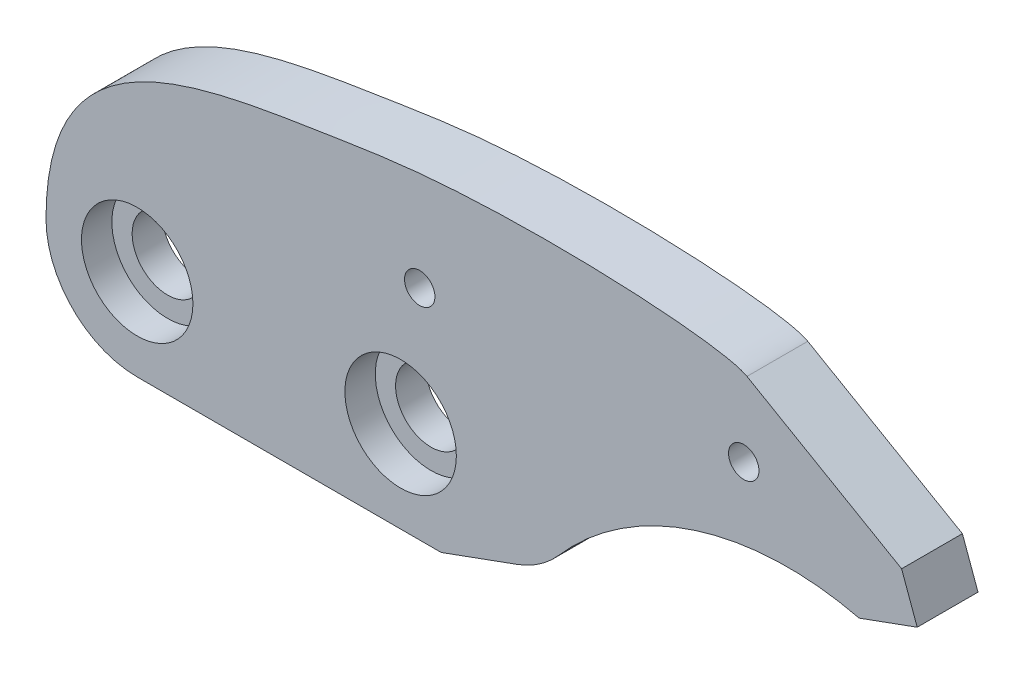
ISO-10303-21;
HEADER;
FILE_DESCRIPTION(('STEP AP214'),'2;1');
FILE_NAME('part.step','',(''),(''),'','','');
FILE_SCHEMA(('AUTOMOTIVE_DESIGN { 1 0 10303 214 1 1 1 1 }'));
ENDSEC;
DATA;
#1=APPLICATION_CONTEXT('core data for automotive mechanical design processes');
#2=APPLICATION_PROTOCOL_DEFINITION('international standard','automotive_design',2000,#1);
#3=PRODUCT_CONTEXT('',#1,'mechanical');
#4=PRODUCT('Part','Part','',(#3));
#5=PRODUCT_RELATED_PRODUCT_CATEGORY('part','',(#4));
#6=PRODUCT_DEFINITION_FORMATION('','',#4);
#7=PRODUCT_DEFINITION_CONTEXT('part definition',#1,'design');
#8=PRODUCT_DEFINITION('design','',#6,#7);
#9=PRODUCT_DEFINITION_SHAPE('','',#8);
#10=(LENGTH_UNIT() NAMED_UNIT(*) SI_UNIT(.MILLI.,.METRE.));
#11=(NAMED_UNIT(*) PLANE_ANGLE_UNIT() SI_UNIT($,.RADIAN.));
#12=(NAMED_UNIT(*) SI_UNIT($,.STERADIAN.) SOLID_ANGLE_UNIT());
#13=UNCERTAINTY_MEASURE_WITH_UNIT(LENGTH_MEASURE(1.E-05),#10,'distance_accuracy_value','');
#14=(GEOMETRIC_REPRESENTATION_CONTEXT(3) GLOBAL_UNCERTAINTY_ASSIGNED_CONTEXT((#13)) GLOBAL_UNIT_ASSIGNED_CONTEXT((#10,
#11,#12)) REPRESENTATION_CONTEXT('',''));
#15=CARTESIAN_POINT('',(0.,0.,0.));
#16=DIRECTION('',(0.,0.,1.));
#17=DIRECTION('',(1.,0.,0.));
#18=AXIS2_PLACEMENT_3D('',#15,#16,#17);
#19=CARTESIAN_POINT('',(0.,0.,6.));
#20=DIRECTION('',(0.,0.,-1.));
#21=DIRECTION('',(-1.,0.,0.));
#22=AXIS2_PLACEMENT_3D('',#19,#20,#21);
#23=CYLINDRICAL_SURFACE('',#22,3.5);
#24=CARTESIAN_POINT('',(0.,0.,0.));
#25=DIRECTION('',(0.,0.,1.));
#26=DIRECTION('',(1.,0.,0.));
#27=AXIS2_PLACEMENT_3D('',#24,#25,#26);
#28=CIRCLE('',#27,3.5);
#29=CARTESIAN_POINT('',(-3.5,0.,0.));
#30=VERTEX_POINT('',#29);
#31=EDGE_CURVE('E266',#30,#30,#28,.T.);
#32=CARTESIAN_POINT('',(0.,0.,3.));
#33=DIRECTION('',(0.,0.,1.));
#34=DIRECTION('',(1.,0.,0.));
#35=AXIS2_PLACEMENT_3D('',#32,#33,#34);
#36=CIRCLE('',#35,3.5);
#37=CARTESIAN_POINT('',(-3.5,0.,3.));
#38=VERTEX_POINT('',#37);
#39=EDGE_CURVE('E42',#38,#38,#36,.T.);
#40=CARTESIAN_POINT('',(-3.5,0.,0.));
#41=CARTESIAN_POINT('',(-3.5,0.,0.03125));
#42=CARTESIAN_POINT('',(-3.5,0.,0.0625000000000001));
#43=CARTESIAN_POINT('',(-3.5,0.,0.125));
#44=CARTESIAN_POINT('',(-3.5,0.,0.15625));
#45=CARTESIAN_POINT('',(-3.5,0.,0.21875));
#46=CARTESIAN_POINT('',(-3.5,0.,0.25));
#47=CARTESIAN_POINT('',(-3.5,0.,0.3125));
#48=CARTESIAN_POINT('',(-3.5,0.,0.34375));
#49=CARTESIAN_POINT('',(-3.5,0.,0.40625));
#50=CARTESIAN_POINT('',(-3.5,0.,0.4375));
#51=CARTESIAN_POINT('',(-3.5,0.,0.5));
#52=CARTESIAN_POINT('',(-3.5,0.,0.53125));
#53=CARTESIAN_POINT('',(-3.5,0.,0.593750000000001));
#54=CARTESIAN_POINT('',(-3.5,0.,0.625000000000001));
#55=CARTESIAN_POINT('',(-3.5,0.,0.687500000000001));
#56=CARTESIAN_POINT('',(-3.5,0.,0.718750000000001));
#57=CARTESIAN_POINT('',(-3.5,0.,0.781250000000001));
#58=CARTESIAN_POINT('',(-3.5,0.,0.812500000000001));
#59=CARTESIAN_POINT('',(-3.5,0.,0.875));
#60=CARTESIAN_POINT('',(-3.5,0.,0.90625));
#61=CARTESIAN_POINT('',(-3.5,0.,0.96875));
#62=CARTESIAN_POINT('',(-3.5,0.,1.));
#63=CARTESIAN_POINT('',(-3.5,0.,1.0625));
#64=CARTESIAN_POINT('',(-3.5,0.,1.09375));
#65=CARTESIAN_POINT('',(-3.5,0.,1.15625));
#66=CARTESIAN_POINT('',(-3.5,0.,1.1875));
#67=CARTESIAN_POINT('',(-3.5,0.,1.25));
#68=CARTESIAN_POINT('',(-3.5,0.,1.28125));
#69=CARTESIAN_POINT('',(-3.5,0.,1.34375));
#70=CARTESIAN_POINT('',(-3.5,0.,1.375));
#71=CARTESIAN_POINT('',(-3.5,0.,1.4375));
#72=CARTESIAN_POINT('',(-3.5,0.,1.46875));
#73=CARTESIAN_POINT('',(-3.5,0.,1.53125));
#74=CARTESIAN_POINT('',(-3.5,0.,1.5625));
#75=CARTESIAN_POINT('',(-3.5,0.,1.625));
#76=CARTESIAN_POINT('',(-3.5,0.,1.65625));
#77=CARTESIAN_POINT('',(-3.5,0.,1.71875));
#78=CARTESIAN_POINT('',(-3.5,0.,1.75));
#79=CARTESIAN_POINT('',(-3.5,0.,1.8125));
#80=CARTESIAN_POINT('',(-3.5,0.,1.84375));
#81=CARTESIAN_POINT('',(-3.5,0.,1.90625));
#82=CARTESIAN_POINT('',(-3.5,0.,1.9375));
#83=CARTESIAN_POINT('',(-3.5,0.,2.));
#84=CARTESIAN_POINT('',(-3.5,0.,2.03125));
#85=CARTESIAN_POINT('',(-3.5,0.,2.09375));
#86=CARTESIAN_POINT('',(-3.5,0.,2.125));
#87=CARTESIAN_POINT('',(-3.5,0.,2.1875));
#88=CARTESIAN_POINT('',(-3.5,0.,2.21875));
#89=CARTESIAN_POINT('',(-3.5,0.,2.28125));
#90=CARTESIAN_POINT('',(-3.5,0.,2.3125));
#91=CARTESIAN_POINT('',(-3.5,0.,2.375));
#92=CARTESIAN_POINT('',(-3.5,0.,2.40625));
#93=CARTESIAN_POINT('',(-3.5,0.,2.46875));
#94=CARTESIAN_POINT('',(-3.5,0.,2.5));
#95=CARTESIAN_POINT('',(-3.5,0.,2.5625));
#96=CARTESIAN_POINT('',(-3.5,0.,2.59375));
#97=CARTESIAN_POINT('',(-3.5,0.,2.65625));
#98=CARTESIAN_POINT('',(-3.5,0.,2.6875));
#99=CARTESIAN_POINT('',(-3.5,0.,2.75));
#100=CARTESIAN_POINT('',(-3.5,0.,2.78125));
#101=CARTESIAN_POINT('',(-3.5,0.,2.84375));
#102=CARTESIAN_POINT('',(-3.5,0.,2.875));
#103=CARTESIAN_POINT('',(-3.5,0.,2.9375));
#104=CARTESIAN_POINT('',(-3.5,0.,2.96875));
#105=CARTESIAN_POINT('',(-3.5,0.,3.));
#106=B_SPLINE_CURVE_WITH_KNOTS('',3,(#40,#41,#42,#43,#44,#45,#46,#47,#48,#49,#50,#51,#52,#53,
#54,#55,#56,#57,#58,#59,#60,#61,#62,#63,#64,#65,#66,#67,#68,#69,#70,#71,#72,#73,#74,#75,#76,#77,
#78,#79,#80,#81,#82,#83,#84,#85,#86,#87,#88,#89,#90,#91,#92,#93,#94,#95,#96,#97,#98,#99,#100,
#101,#102,#103,#104,#105),.UNSPECIFIED.,.F.,.F.,(4,2,2,2,2,2,2,2,2,2,2,2,2,2,2,2,2,2,2,2,2,2,2,
2,2,2,2,2,2,2,2,2,4),(0.,0.0937500000000001,0.1875,0.28125,0.375,0.46875,0.5625,
0.656250000000001,0.750000000000001,0.843750000000001,0.9375,1.03125,1.125,1.21875,1.3125,
1.40625,1.5,1.59375,1.6875,1.78125,1.875,1.96875,2.0625,2.15625,2.25,2.34375,2.4375,2.53125,
2.625,2.71875,2.8125,2.90625,3.),.UNSPECIFIED.);
#107=EDGE_CURVE('BSEAM38',#30,#38,#106,.T.);
#108=ORIENTED_EDGE('',*,*,#31,.F.);
#109=ORIENTED_EDGE('',*,*,#39,.T.);
#110=ORIENTED_EDGE('',*,*,#107,.T.);
#111=ORIENTED_EDGE('',*,*,#107,.F.);
#112=EDGE_LOOP('',(#108,#110,#109,#111));
#113=FACE_BOUND('',#112,.T.);
#114=ADVANCED_FACE('F38',(#113),#23,.F.);
#115=CARTESIAN_POINT('',(26.,0.,6.));
#116=DIRECTION('',(0.,0.,-1.));
#117=DIRECTION('',(-1.,0.,0.));
#118=AXIS2_PLACEMENT_3D('',#115,#116,#117);
#119=CYLINDRICAL_SURFACE('',#118,3.5);
#120=CARTESIAN_POINT('',(26.,0.,0.));
#121=DIRECTION('',(0.,0.,1.));
#122=DIRECTION('',(1.,0.,0.));
#123=AXIS2_PLACEMENT_3D('',#120,#121,#122);
#124=CIRCLE('',#123,3.5);
#125=CARTESIAN_POINT('',(22.5,0.,0.));
#126=VERTEX_POINT('',#125);
#127=EDGE_CURVE('E127',#126,#126,#124,.T.);
#128=CARTESIAN_POINT('',(26.,0.,3.));
#129=DIRECTION('',(0.,0.,1.));
#130=DIRECTION('',(1.,0.,0.));
#131=AXIS2_PLACEMENT_3D('',#128,#129,#130);
#132=CIRCLE('',#131,3.5);
#133=CARTESIAN_POINT('',(22.5,0.,3.));
#134=VERTEX_POINT('',#133);
#135=EDGE_CURVE('E165',#134,#134,#132,.T.);
#136=CARTESIAN_POINT('',(22.5,0.,0.));
#137=CARTESIAN_POINT('',(22.5,0.,0.03125));
#138=CARTESIAN_POINT('',(22.5,0.,0.0625000000000001));
#139=CARTESIAN_POINT('',(22.5,0.,0.125));
#140=CARTESIAN_POINT('',(22.5,0.,0.15625));
#141=CARTESIAN_POINT('',(22.5,0.,0.21875));
#142=CARTESIAN_POINT('',(22.5,0.,0.25));
#143=CARTESIAN_POINT('',(22.5,0.,0.3125));
#144=CARTESIAN_POINT('',(22.5,0.,0.34375));
#145=CARTESIAN_POINT('',(22.5,0.,0.40625));
#146=CARTESIAN_POINT('',(22.5,0.,0.4375));
#147=CARTESIAN_POINT('',(22.5,0.,0.5));
#148=CARTESIAN_POINT('',(22.5,0.,0.53125));
#149=CARTESIAN_POINT('',(22.5,0.,0.593750000000001));
#150=CARTESIAN_POINT('',(22.5,0.,0.625000000000001));
#151=CARTESIAN_POINT('',(22.5,0.,0.687500000000001));
#152=CARTESIAN_POINT('',(22.5,0.,0.718750000000001));
#153=CARTESIAN_POINT('',(22.5,0.,0.781250000000001));
#154=CARTESIAN_POINT('',(22.5,0.,0.812500000000001));
#155=CARTESIAN_POINT('',(22.5,0.,0.875));
#156=CARTESIAN_POINT('',(22.5,0.,0.90625));
#157=CARTESIAN_POINT('',(22.5,0.,0.96875));
#158=CARTESIAN_POINT('',(22.5,0.,1.));
#159=CARTESIAN_POINT('',(22.5,0.,1.0625));
#160=CARTESIAN_POINT('',(22.5,0.,1.09375));
#161=CARTESIAN_POINT('',(22.5,0.,1.15625));
#162=CARTESIAN_POINT('',(22.5,0.,1.1875));
#163=CARTESIAN_POINT('',(22.5,0.,1.25));
#164=CARTESIAN_POINT('',(22.5,0.,1.28125));
#165=CARTESIAN_POINT('',(22.5,0.,1.34375));
#166=CARTESIAN_POINT('',(22.5,0.,1.375));
#167=CARTESIAN_POINT('',(22.5,0.,1.4375));
#168=CARTESIAN_POINT('',(22.5,0.,1.46875));
#169=CARTESIAN_POINT('',(22.5,0.,1.53125));
#170=CARTESIAN_POINT('',(22.5,0.,1.5625));
#171=CARTESIAN_POINT('',(22.5,0.,1.625));
#172=CARTESIAN_POINT('',(22.5,0.,1.65625));
#173=CARTESIAN_POINT('',(22.5,0.,1.71875));
#174=CARTESIAN_POINT('',(22.5,0.,1.75));
#175=CARTESIAN_POINT('',(22.5,0.,1.8125));
#176=CARTESIAN_POINT('',(22.5,0.,1.84375));
#177=CARTESIAN_POINT('',(22.5,0.,1.90625));
#178=CARTESIAN_POINT('',(22.5,0.,1.9375));
#179=CARTESIAN_POINT('',(22.5,0.,2.));
#180=CARTESIAN_POINT('',(22.5,0.,2.03125));
#181=CARTESIAN_POINT('',(22.5,0.,2.09375));
#182=CARTESIAN_POINT('',(22.5,0.,2.125));
#183=CARTESIAN_POINT('',(22.5,0.,2.1875));
#184=CARTESIAN_POINT('',(22.5,0.,2.21875));
#185=CARTESIAN_POINT('',(22.5,0.,2.28125));
#186=CARTESIAN_POINT('',(22.5,0.,2.3125));
#187=CARTESIAN_POINT('',(22.5,0.,2.375));
#188=CARTESIAN_POINT('',(22.5,0.,2.40625));
#189=CARTESIAN_POINT('',(22.5,0.,2.46875));
#190=CARTESIAN_POINT('',(22.5,0.,2.5));
#191=CARTESIAN_POINT('',(22.5,0.,2.5625));
#192=CARTESIAN_POINT('',(22.5,0.,2.59375));
#193=CARTESIAN_POINT('',(22.5,0.,2.65625));
#194=CARTESIAN_POINT('',(22.5,0.,2.6875));
#195=CARTESIAN_POINT('',(22.5,0.,2.75));
#196=CARTESIAN_POINT('',(22.5,0.,2.78125));
#197=CARTESIAN_POINT('',(22.5,0.,2.84375));
#198=CARTESIAN_POINT('',(22.5,0.,2.875));
#199=CARTESIAN_POINT('',(22.5,0.,2.9375));
#200=CARTESIAN_POINT('',(22.5,0.,2.96875));
#201=CARTESIAN_POINT('',(22.5,0.,3.));
#202=B_SPLINE_CURVE_WITH_KNOTS('',3,(#136,#137,#138,#139,#140,#141,#142,#143,#144,#145,#146,
#147,#148,#149,#150,#151,#152,#153,#154,#155,#156,#157,#158,#159,#160,#161,#162,#163,#164,#165,
#166,#167,#168,#169,#170,#171,#172,#173,#174,#175,#176,#177,#178,#179,#180,#181,#182,#183,#184,
#185,#186,#187,#188,#189,#190,#191,#192,#193,#194,#195,#196,#197,#198,#199,#200,#201),
.UNSPECIFIED.,.F.,.F.,(4,2,2,2,2,2,2,2,2,2,2,2,2,2,2,2,2,2,2,2,2,2,2,2,2,2,2,2,2,2,2,2,4),(0.,
0.0937500000000001,0.1875,0.28125,0.375,0.46875,0.5625,0.656250000000001,0.750000000000001,
0.843750000000001,0.9375,1.03125,1.125,1.21875,1.3125,1.40625,1.5,1.59375,1.6875,1.78125,1.875,
1.96875,2.0625,2.15625,2.25,2.34375,2.4375,2.53125,2.625,2.71875,2.8125,2.90625,3.),.UNSPECIFIED.);
#203=EDGE_CURVE('BSEAM257',#126,#134,#202,.T.);
#204=ORIENTED_EDGE('',*,*,#127,.F.);
#205=ORIENTED_EDGE('',*,*,#135,.T.);
#206=ORIENTED_EDGE('',*,*,#203,.T.);
#207=ORIENTED_EDGE('',*,*,#203,.F.);
#208=EDGE_LOOP('',(#204,#206,#205,#207));
#209=FACE_BOUND('',#208,.T.);
#210=ADVANCED_FACE('F257',(#209),#119,.F.);
#211=CARTESIAN_POINT('',(6.40187759680475,-17.5890141393335,6.));
#212=DIRECTION('',(-0.342020143325669,0.939692620785909,0.));
#213=DIRECTION('',(-0.939692620785909,-0.342020143325669,0.));
#214=AXIS2_PLACEMENT_3D('',#211,#212,#213);
#215=PLANE('',#214);
#216=DIRECTION('',(0.939692620785909,0.342020143325669,0.));
#217=VECTOR('',#216,1.);
#218=CARTESIAN_POINT('',(6.40187759680475,-17.5890141393335,6.));
#219=LINE('',#218,#217);
#220=CARTESIAN_POINT('',(71.2548879464198,6.01555123048434,6.));
#221=VERTEX_POINT('',#220);
#222=CARTESIAN_POINT('',(76.9846310392954,8.10100716628343,6.));
#223=VERTEX_POINT('',#222);
#224=EDGE_CURVE('E126',#221,#223,#219,.T.);
#225=ORIENTED_EDGE('',*,*,#224,.F.);
#226=DIRECTION('',(0.,0.,-1.));
#227=VECTOR('',#226,1.);
#228=CARTESIAN_POINT('',(71.2548879464198,6.01555123048434,10.));
#229=LINE('',#228,#227);
#230=CARTESIAN_POINT('',(71.2548879464198,6.01555123048433,0.));
#231=VERTEX_POINT('',#230);
#232=EDGE_CURVE('E111',#221,#231,#229,.T.);
#233=ORIENTED_EDGE('',*,*,#232,.T.);
#234=DIRECTION('',(0.939692620785909,0.342020143325669,0.));
#235=VECTOR('',#234,1.);
#236=CARTESIAN_POINT('',(6.40187759680475,-17.5890141393335,0.));
#237=LINE('',#236,#235);
#238=CARTESIAN_POINT('',(76.9846310392954,8.10100716628343,0.));
#239=VERTEX_POINT('',#238);
#240=EDGE_CURVE('E124',#231,#239,#237,.T.);
#241=ORIENTED_EDGE('',*,*,#240,.T.);
#242=DIRECTION('',(0.,0.,-1.));
#243=VECTOR('',#242,1.);
#244=CARTESIAN_POINT('',(76.9846310392954,8.10100716628343,6.));
#245=LINE('',#244,#243);
#246=EDGE_CURVE('E152',#223,#239,#245,.T.);
#247=ORIENTED_EDGE('',*,*,#246,.F.);
#248=EDGE_LOOP('',(#225,#233,#241,#247));
#249=FACE_BOUND('',#248,.T.);
#250=ADVANCED_FACE('F122',(#249),#215,.F.);
#251=CARTESIAN_POINT('',(0.,0.,6.));
#252=DIRECTION('',(0.,0.,-1.));
#253=DIRECTION('',(-1.,0.,0.));
#254=AXIS2_PLACEMENT_3D('',#251,#252,#253);
#255=CYLINDRICAL_SURFACE('',#254,9.);
#256=CARTESIAN_POINT('',(0.,0.,6.));
#257=DIRECTION('',(0.,0.,1.));
#258=DIRECTION('',(1.,0.,0.));
#259=AXIS2_PLACEMENT_3D('',#256,#257,#258);
#260=CIRCLE('',#259,9.);
#261=CARTESIAN_POINT('',(-9.,0.,6.));
#262=VERTEX_POINT('',#261);
#263=CARTESIAN_POINT('',(0.,-9.,6.));
#264=VERTEX_POINT('',#263);
#265=EDGE_CURVE('E55',#262,#264,#260,.T.);
#266=ORIENTED_EDGE('',*,*,#265,.F.);
#267=DIRECTION('',(0.,0.,-1.));
#268=VECTOR('',#267,1.);
#269=CARTESIAN_POINT('',(-9.,0.,79.1754629659332));
#270=LINE('',#269,#268);
#271=CARTESIAN_POINT('',(-9.,0.,0.));
#272=VERTEX_POINT('',#271);
#273=EDGE_CURVE('E59',#262,#272,#270,.T.);
#274=ORIENTED_EDGE('',*,*,#273,.T.);
#275=CARTESIAN_POINT('',(0.,0.,0.));
#276=DIRECTION('',(0.,0.,1.));
#277=DIRECTION('',(1.,0.,0.));
#278=AXIS2_PLACEMENT_3D('',#275,#276,#277);
#279=CIRCLE('',#278,9.);
#280=CARTESIAN_POINT('',(0.,-9.,0.));
#281=VERTEX_POINT('',#280);
#282=EDGE_CURVE('E138',#272,#281,#279,.T.);
#283=ORIENTED_EDGE('',*,*,#282,.T.);
#284=DIRECTION('',(0.,0.,-1.));
#285=VECTOR('',#284,1.);
#286=CARTESIAN_POINT('',(0.,-9.,6.));
#287=LINE('',#286,#285);
#288=EDGE_CURVE('E157',#264,#281,#287,.T.);
#289=ORIENTED_EDGE('',*,*,#288,.F.);
#290=EDGE_LOOP('',(#266,#274,#283,#289));
#291=FACE_BOUND('',#290,.T.);
#292=ADVANCED_FACE('F252',(#291),#255,.T.);
#293=CARTESIAN_POINT('',(0.,-9.,6.));
#294=DIRECTION('',(0.,1.,0.));
#295=DIRECTION('',(0.,0.,1.));
#296=AXIS2_PLACEMENT_3D('',#293,#294,#295);
#297=PLANE('',#296);
#298=DIRECTION('',(1.,0.,0.));
#299=VECTOR('',#298,1.);
#300=CARTESIAN_POINT('',(0.,-9.,0.));
#301=LINE('',#300,#299);
#302=CARTESIAN_POINT('',(30.,-9.,0.));
#303=VERTEX_POINT('',#302);
#304=EDGE_CURVE('E135',#281,#303,#301,.T.);
#305=ORIENTED_EDGE('',*,*,#304,.T.);
#306=DIRECTION('',(0.,0.,-1.));
#307=VECTOR('',#306,1.);
#308=CARTESIAN_POINT('',(30.,-9.,6.));
#309=LINE('',#308,#307);
#310=CARTESIAN_POINT('',(30.,-9.,6.));
#311=VERTEX_POINT('',#310);
#312=EDGE_CURVE('E154',#311,#303,#309,.T.);
#313=ORIENTED_EDGE('',*,*,#312,.F.);
#314=DIRECTION('',(1.,0.,0.));
#315=VECTOR('',#314,1.);
#316=CARTESIAN_POINT('',(0.,-9.,6.));
#317=LINE('',#316,#315);
#318=EDGE_CURVE('E276',#264,#311,#317,.T.);
#319=ORIENTED_EDGE('',*,*,#318,.F.);
#320=ORIENTED_EDGE('',*,*,#288,.T.);
#321=EDGE_LOOP('',(#305,#313,#319,#320));
#322=FACE_BOUND('',#321,.T.);
#323=ADVANCED_FACE('F248',(#322),#297,.F.);
#324=CARTESIAN_POINT('',(37.4747793850678,-6.27940279612869,0.));
#325=VERTEX_POINT('',#324);
#326=EDGE_CURVE('E134',#303,#325,#237,.T.);
#327=ORIENTED_EDGE('',*,*,#326,.T.);
#328=DIRECTION('',(0.,0.,-1.));
#329=VECTOR('',#328,1.);
#330=CARTESIAN_POINT('',(37.4747793850678,-6.27940279612869,6.));
#331=LINE('',#330,#329);
#332=CARTESIAN_POINT('',(37.4747793850678,-6.27940279612869,6.));
#333=VERTEX_POINT('',#332);
#334=EDGE_CURVE('E160',#325,#333,#331,.F.);
#335=ORIENTED_EDGE('',*,*,#334,.T.);
#336=EDGE_CURVE('E283',#311,#333,#219,.T.);
#337=ORIENTED_EDGE('',*,*,#336,.F.);
#338=ORIENTED_EDGE('',*,*,#312,.T.);
#339=EDGE_LOOP('',(#327,#335,#337,#338));
#340=FACE_BOUND('',#339,.T.);
#341=ADVANCED_FACE('F244',(#340),#215,.F.);
#342=CARTESIAN_POINT('',(70.5827534424907,25.6900213056169,6.));
#343=DIRECTION('',(-0.939692620785909,-0.342020143325668,0.));
#344=DIRECTION('',(0.342020143325668,-0.939692620785909,0.));
#345=AXIS2_PLACEMENT_3D('',#342,#343,#344);
#346=PLANE('',#345);
#347=DIRECTION('',(-0.342020143325668,0.939692620785909,0.));
#348=VECTOR('',#347,1.);
#349=CARTESIAN_POINT('',(70.5827534424907,25.6900213056169,0.));
#350=LINE('',#349,#348);
#351=CARTESIAN_POINT('',(75.4455403943299,12.32962395982,0.));
#352=VERTEX_POINT('',#351);
#353=EDGE_CURVE('E133',#239,#352,#350,.T.);
#354=ORIENTED_EDGE('',*,*,#353,.T.);
#355=DIRECTION('',(0.,0.,-1.));
#356=VECTOR('',#355,1.);
#357=CARTESIAN_POINT('',(75.4455403943299,12.32962395982,6.));
#358=LINE('',#357,#356);
#359=CARTESIAN_POINT('',(75.4455403943299,12.32962395982,6.));
#360=VERTEX_POINT('',#359);
#361=EDGE_CURVE('E148',#360,#352,#358,.T.);
#362=ORIENTED_EDGE('',*,*,#361,.F.);
#363=DIRECTION('',(-0.342020143325668,0.939692620785909,0.));
#364=VECTOR('',#363,1.);
#365=CARTESIAN_POINT('',(70.5827534424907,25.6900213056169,6.));
#366=LINE('',#365,#364);
#367=EDGE_CURVE('E287',#223,#360,#366,.T.);
#368=ORIENTED_EDGE('',*,*,#367,.F.);
#369=ORIENTED_EDGE('',*,*,#246,.T.);
#370=EDGE_LOOP('',(#354,#362,#368,#369));
#371=FACE_BOUND('',#370,.T.);
#372=ADVANCED_FACE('F240',(#371),#346,.F.);
#373=CARTESIAN_POINT('',(24.200268882739,41.9160952617323,6.));
#374=DIRECTION('',(-0.499999999999998,-0.86602540378444,0.));
#375=DIRECTION('',(0.86602540378444,-0.499999999999998,0.));
#376=AXIS2_PLACEMENT_3D('',#373,#374,#375);
#377=PLANE('',#376);
#378=DIRECTION('',(-0.86602540378444,0.499999999999998,0.));
#379=VECTOR('',#378,1.);
#380=CARTESIAN_POINT('',(24.200268882739,41.9160952617323,0.));
#381=LINE('',#380,#379);
#382=CARTESIAN_POINT('',(60.1835760838935,21.1411231628129,0.));
#383=VERTEX_POINT('',#382);
#384=EDGE_CURVE('E143',#352,#383,#381,.T.);
#385=ORIENTED_EDGE('',*,*,#384,.T.);
#386=DIRECTION('',(0.,0.,-1.));
#387=VECTOR('',#386,1.);
#388=CARTESIAN_POINT('',(60.1835760838935,21.1411231628129,6.));
#389=LINE('',#388,#387);
#390=CARTESIAN_POINT('',(60.1835760838935,21.1411231628129,6.));
#391=VERTEX_POINT('',#390);
#392=EDGE_CURVE('E145',#391,#383,#389,.T.);
#393=ORIENTED_EDGE('',*,*,#392,.F.);
#394=DIRECTION('',(-0.86602540378444,0.499999999999998,0.));
#395=VECTOR('',#394,1.);
#396=CARTESIAN_POINT('',(24.200268882739,41.9160952617323,6.));
#397=LINE('',#396,#395);
#398=EDGE_CURVE('E149',#360,#391,#397,.T.);
#399=ORIENTED_EDGE('',*,*,#398,.F.);
#400=ORIENTED_EDGE('',*,*,#361,.T.);
#401=EDGE_LOOP('',(#385,#393,#399,#400));
#402=FACE_BOUND('',#401,.T.);
#403=ADVANCED_FACE('F233',(#402),#377,.F.);
#404=CARTESIAN_POINT('',(0.,0.,6.));
#405=DIRECTION('',(0.,0.,1.));
#406=DIRECTION('',(1.,0.,0.));
#407=AXIS2_PLACEMENT_3D('',#404,#405,#406);
#408=PLANE('',#407);
#409=CARTESIAN_POINT('',(0.,0.,6.));
#410=DIRECTION('',(0.,0.,1.));
#411=DIRECTION('',(1.,0.,0.));
#412=AXIS2_PLACEMENT_3D('',#409,#410,#411);
#413=CIRCLE('',#412,5.5);
#414=CARTESIAN_POINT('',(5.5,0.,6.));
#415=VERTEX_POINT('',#414);
#416=EDGE_CURVE('E173',#415,#415,#413,.T.);
#417=ORIENTED_EDGE('',*,*,#416,.F.);
#418=EDGE_LOOP('',(#417));
#419=FACE_BOUND('',#418,.T.);
#420=CARTESIAN_POINT('',(26.,0.,6.));
#421=DIRECTION('',(0.,0.,1.));
#422=DIRECTION('',(1.,0.,0.));
#423=AXIS2_PLACEMENT_3D('',#420,#421,#422);
#424=CIRCLE('',#423,5.5);
#425=CARTESIAN_POINT('',(31.5,0.,6.));
#426=VERTEX_POINT('',#425);
#427=EDGE_CURVE('E183',#426,#426,#424,.T.);
#428=ORIENTED_EDGE('',*,*,#427,.F.);
#429=EDGE_LOOP('',(#428));
#430=FACE_BOUND('',#429,.T.);
#431=CARTESIAN_POINT('',(59.8656137459827,13.6633130650325,6.));
#432=DIRECTION('',(0.,0.,1.));
#433=DIRECTION('',(1.,0.,0.));
#434=AXIS2_PLACEMENT_3D('',#431,#432,#433);
#435=CIRCLE('',#434,1.5);
#436=CARTESIAN_POINT('',(61.3656137459827,13.6633130650325,6.));
#437=VERTEX_POINT('',#436);
#438=EDGE_CURVE('E194',#437,#437,#435,.T.);
#439=ORIENTED_EDGE('',*,*,#438,.F.);
#440=EDGE_LOOP('',(#439));
#441=FACE_BOUND('',#440,.T.);
#442=CARTESIAN_POINT('',(27.8851072813716,12.5465291705524,6.));
#443=DIRECTION('',(0.,0.,1.));
#444=DIRECTION('',(1.,0.,0.));
#445=AXIS2_PLACEMENT_3D('',#442,#443,#444);
#446=CIRCLE('',#445,1.5);
#447=CARTESIAN_POINT('',(29.3851072813716,12.5465291705524,6.));
#448=VERTEX_POINT('',#447);
#449=EDGE_CURVE('E189',#448,#448,#446,.T.);
#450=ORIENTED_EDGE('',*,*,#449,.F.);
#451=EDGE_LOOP('',(#450));
#452=FACE_BOUND('',#451,.T.);
#453=CARTESIAN_POINT('',(60.1835760838935,21.1411231628129,6.00000000000001));
#454=CARTESIAN_POINT('',(57.5829949431317,22.6425693844812,6.00000000000001));
#455=CARTESIAN_POINT('',(35.7853664484623,23.8386488820733,6.00000000000001));
#456=CARTESIAN_POINT('',(8.37706294240831,19.4400192343514,6.00000000000001));
#457=CARTESIAN_POINT('',(-9.00000000000002,16.9140467504502,6.00000000000001));
#458=CARTESIAN_POINT('',(-9.00000000000001,0.,6.00000000000001));
#459=B_SPLINE_CURVE_WITH_KNOTS('',3,(#453,#454,#455,#456,#457,#458),.UNSPECIFIED.,.F.,.F.,(4,1,
1,4),(0.,0.435384132930644,0.535384132930644,1.),.UNSPECIFIED.);
#460=EDGE_CURVE('E118',#391,#262,#459,.T.);
#461=ORIENTED_EDGE('',*,*,#460,.T.);
#462=ORIENTED_EDGE('',*,*,#265,.T.);
#463=ORIENTED_EDGE('',*,*,#318,.T.);
#464=ORIENTED_EDGE('',*,*,#336,.T.);
#465=CARTESIAN_POINT('',(34.0545779518111,3.1175234117304,6.));
#466=DIRECTION('',(0.,0.,1.));
#467=DIRECTION('',(1.,0.,0.));
#468=AXIS2_PLACEMENT_3D('',#465,#466,#467);
#469=CIRCLE('',#468,10.);
#470=CARTESIAN_POINT('',(41.596521544483,-3.44898912118657,6.));
#471=VERTEX_POINT('',#470);
#472=EDGE_CURVE('E163',#333,#471,#469,.T.);
#473=ORIENTED_EDGE('',*,*,#472,.T.);
#474=CARTESIAN_POINT('',(64.2223523224986,-23.1485267199375,6.));
#475=DIRECTION('',(0.,0.,1.));
#476=DIRECTION('',(1.,0.,0.));
#477=AXIS2_PLACEMENT_3D('',#474,#475,#476);
#478=CIRCLE('',#477,30.);
#479=EDGE_CURVE('E117',#221,#471,#478,.T.);
#480=ORIENTED_EDGE('',*,*,#479,.F.);
#481=ORIENTED_EDGE('',*,*,#224,.T.);
#482=ORIENTED_EDGE('',*,*,#367,.T.);
#483=ORIENTED_EDGE('',*,*,#398,.T.);
#484=EDGE_LOOP('',(#461,#462,#463,#464,#473,#480,#481,#482,#483));
#485=FACE_BOUND('',#484,.T.);
#486=ADVANCED_FACE('F230',(#419,#430,#441,#452,#485),#408,.T.);
#487=CARTESIAN_POINT('',(0.,0.,0.));
#488=DIRECTION('',(0.,0.,1.));
#489=DIRECTION('',(1.,0.,0.));
#490=AXIS2_PLACEMENT_3D('',#487,#488,#489);
#491=PLANE('',#490);
#492=CARTESIAN_POINT('',(59.8656137459827,13.6633130650325,0.));
#493=DIRECTION('',(0.,0.,-1.));
#494=DIRECTION('',(-1.,0.,0.));
#495=AXIS2_PLACEMENT_3D('',#492,#493,#494);
#496=CIRCLE('',#495,1.5);
#497=CARTESIAN_POINT('',(58.3656137459827,13.6633130650325,0.));
#498=VERTEX_POINT('',#497);
#499=EDGE_CURVE('E186',#498,#498,#496,.T.);
#500=ORIENTED_EDGE('',*,*,#499,.F.);
#501=EDGE_LOOP('',(#500));
#502=FACE_BOUND('',#501,.T.);
#503=CARTESIAN_POINT('',(27.8851072813716,12.5465291705524,0.));
#504=DIRECTION('',(0.,0.,-1.));
#505=DIRECTION('',(-1.,0.,0.));
#506=AXIS2_PLACEMENT_3D('',#503,#504,#505);
#507=CIRCLE('',#506,1.5);
#508=CARTESIAN_POINT('',(26.3851072813716,12.5465291705524,0.));
#509=VERTEX_POINT('',#508);
#510=EDGE_CURVE('E171',#509,#509,#507,.T.);
#511=ORIENTED_EDGE('',*,*,#510,.F.);
#512=EDGE_LOOP('',(#511));
#513=FACE_BOUND('',#512,.T.);
#514=ORIENTED_EDGE('',*,*,#282,.F.);
#515=CARTESIAN_POINT('',(60.1835760838935,21.1411231628129,0.));
#516=CARTESIAN_POINT('',(57.5829949431317,22.6425693844812,0.));
#517=CARTESIAN_POINT('',(35.7853664484623,23.8386488820733,0.));
#518=CARTESIAN_POINT('',(8.37706294240831,19.4400192343514,0.));
#519=CARTESIAN_POINT('',(-9.00000000000002,16.9140467504502,0.));
#520=CARTESIAN_POINT('',(-9.00000000000001,0.,0.));
#521=B_SPLINE_CURVE_WITH_KNOTS('',3,(#515,#516,#517,#518,#519,#520),.UNSPECIFIED.,.F.,.F.,(4,1,
1,4),(0.,0.435384132930644,0.535384132930644,1.),.UNSPECIFIED.);
#522=EDGE_CURVE('E197',#383,#272,#521,.T.);
#523=ORIENTED_EDGE('',*,*,#522,.F.);
#524=ORIENTED_EDGE('',*,*,#384,.F.);
#525=ORIENTED_EDGE('',*,*,#353,.F.);
#526=ORIENTED_EDGE('',*,*,#240,.F.);
#527=CARTESIAN_POINT('',(64.2223523224986,-23.1485267199375,0.));
#528=DIRECTION('',(0.,0.,-1.));
#529=DIRECTION('',(-1.,0.,0.));
#530=AXIS2_PLACEMENT_3D('',#527,#528,#529);
#531=CIRCLE('',#530,30.);
#532=CARTESIAN_POINT('',(41.596521544483,-3.44898912118657,0.));
#533=VERTEX_POINT('',#532);
#534=EDGE_CURVE('E107',#533,#231,#531,.T.);
#535=ORIENTED_EDGE('',*,*,#534,.F.);
#536=CARTESIAN_POINT('',(34.0545779518111,3.1175234117304,0.));
#537=DIRECTION('',(0.,0.,1.));
#538=DIRECTION('',(1.,0.,0.));
#539=AXIS2_PLACEMENT_3D('',#536,#537,#538);
#540=CIRCLE('',#539,10.);
#541=EDGE_CURVE('E11',#533,#325,#540,.F.);
#542=ORIENTED_EDGE('',*,*,#541,.T.);
#543=ORIENTED_EDGE('',*,*,#326,.F.);
#544=ORIENTED_EDGE('',*,*,#304,.F.);
#545=EDGE_LOOP('',(#514,#523,#524,#525,#526,#535,#542,#543,#544));
#546=FACE_BOUND('',#545,.T.);
#547=ORIENTED_EDGE('',*,*,#127,.T.);
#548=EDGE_LOOP('',(#547));
#549=FACE_BOUND('',#548,.T.);
#550=ORIENTED_EDGE('',*,*,#31,.T.);
#551=EDGE_LOOP('',(#550));
#552=FACE_BOUND('',#551,.T.);
#553=ADVANCED_FACE('F130',(#502,#513,#546,#549,#552),#491,.F.);
#554=CARTESIAN_POINT('',(64.2223523224986,-23.1485267199375,10.));
#555=DIRECTION('',(0.,0.,-1.));
#556=DIRECTION('',(-1.,0.,0.));
#557=AXIS2_PLACEMENT_3D('',#554,#555,#556);
#558=CYLINDRICAL_SURFACE('',#557,30.);
#559=ORIENTED_EDGE('',*,*,#479,.T.);
#560=DIRECTION('',(0.,0.,-1.));
#561=VECTOR('',#560,1.);
#562=CARTESIAN_POINT('',(41.596521544483,-3.44898912118656,10.));
#563=LINE('',#562,#561);
#564=EDGE_CURVE('E47',#471,#533,#563,.T.);
#565=ORIENTED_EDGE('',*,*,#564,.T.);
#566=ORIENTED_EDGE('',*,*,#534,.T.);
#567=ORIENTED_EDGE('',*,*,#232,.F.);
#568=EDGE_LOOP('',(#559,#565,#566,#567));
#569=FACE_BOUND('',#568,.T.);
#570=ADVANCED_FACE('F110',(#569),#558,.F.);
#571=CARTESIAN_POINT('',(34.0545779518111,3.1175234117304,10.));
#572=DIRECTION('',(0.,0.,-1.));
#573=DIRECTION('',(-1.,0.,0.));
#574=AXIS2_PLACEMENT_3D('',#571,#572,#573);
#575=CYLINDRICAL_SURFACE('',#574,10.);
#576=ORIENTED_EDGE('',*,*,#541,.F.);
#577=ORIENTED_EDGE('',*,*,#564,.F.);
#578=ORIENTED_EDGE('',*,*,#472,.F.);
#579=ORIENTED_EDGE('',*,*,#334,.F.);
#580=EDGE_LOOP('',(#576,#577,#578,#579));
#581=FACE_BOUND('',#580,.T.);
#582=ADVANCED_FACE('F40',(#581),#575,.T.);
#583=CARTESIAN_POINT('',(60.1835760838935,21.1411231628129,79.1754629659332));
#584=CARTESIAN_POINT('',(57.5829949431317,22.6425693844812,79.1754629659332));
#585=CARTESIAN_POINT('',(35.7853664484623,23.8386488820733,79.1754629659332));
#586=CARTESIAN_POINT('',(8.37706294240831,19.4400192343514,79.1754629659332));
#587=CARTESIAN_POINT('',(-9.00000000000002,16.9140467504502,79.1754629659332));
#588=CARTESIAN_POINT('',(-9.00000000000001,0.,79.1754629659332));
#589=B_SPLINE_CURVE_WITH_KNOTS('',3,(#583,#584,#585,#586,#587,#588),.UNSPECIFIED.,.F.,.F.,(4,1,
1,4),(0.,0.435384132930644,0.535384132930644,1.),.UNSPECIFIED.);
#590=DIRECTION('',(0.,0.,-1.));
#591=VECTOR('',#590,1.);
#592=SURFACE_OF_LINEAR_EXTRUSION('',#589,#591);
#593=ORIENTED_EDGE('',*,*,#460,.F.);
#594=ORIENTED_EDGE('',*,*,#392,.T.);
#595=ORIENTED_EDGE('',*,*,#522,.T.);
#596=ORIENTED_EDGE('',*,*,#273,.F.);
#597=EDGE_LOOP('',(#593,#594,#595,#596));
#598=FACE_BOUND('',#597,.T.);
#599=ADVANCED_FACE('F221',(#598),#592,.F.);
#600=CARTESIAN_POINT('',(27.8851072813716,12.5465291705524,14.));
#601=DIRECTION('',(0.,0.,-1.));
#602=DIRECTION('',(-1.,0.,0.));
#603=AXIS2_PLACEMENT_3D('',#600,#601,#602);
#604=CYLINDRICAL_SURFACE('',#603,1.5);
#605=ORIENTED_EDGE('',*,*,#449,.T.);
#606=EDGE_LOOP('',(#605));
#607=FACE_BOUND('',#606,.T.);
#608=ORIENTED_EDGE('',*,*,#510,.T.);
#609=EDGE_LOOP('',(#608));
#610=FACE_BOUND('',#609,.T.);
#611=ADVANCED_FACE('F225',(#607,#610),#604,.F.);
#612=CARTESIAN_POINT('',(59.8656137459827,13.6633130650325,14.));
#613=DIRECTION('',(0.,0.,-1.));
#614=DIRECTION('',(-1.,0.,0.));
#615=AXIS2_PLACEMENT_3D('',#612,#613,#614);
#616=CYLINDRICAL_SURFACE('',#615,1.5);
#617=ORIENTED_EDGE('',*,*,#438,.T.);
#618=EDGE_LOOP('',(#617));
#619=FACE_BOUND('',#618,.T.);
#620=ORIENTED_EDGE('',*,*,#499,.T.);
#621=EDGE_LOOP('',(#620));
#622=FACE_BOUND('',#621,.T.);
#623=ADVANCED_FACE('F309',(#619,#622),#616,.F.);
#624=CARTESIAN_POINT('',(26.,0.,3.));
#625=DIRECTION('',(0.,0.,1.));
#626=DIRECTION('',(1.,0.,0.));
#627=AXIS2_PLACEMENT_3D('',#624,#625,#626);
#628=CYLINDRICAL_SURFACE('',#627,5.5);
#629=CARTESIAN_POINT('',(26.,0.,3.));
#630=DIRECTION('',(0.,0.,1.));
#631=DIRECTION('',(1.,0.,0.));
#632=AXIS2_PLACEMENT_3D('',#629,#630,#631);
#633=CIRCLE('',#632,5.5);
#634=CARTESIAN_POINT('',(31.5,0.,3.));
#635=VERTEX_POINT('',#634);
#636=EDGE_CURVE('E178',#635,#635,#633,.T.);
#637=ORIENTED_EDGE('',*,*,#636,.F.);
#638=EDGE_LOOP('',(#637));
#639=FACE_BOUND('',#638,.T.);
#640=ORIENTED_EDGE('',*,*,#427,.T.);
#641=EDGE_LOOP('',(#640));
#642=FACE_BOUND('',#641,.T.);
#643=ADVANCED_FACE('F317',(#639,#642),#628,.F.);
#644=CARTESIAN_POINT('',(26.,0.,3.));
#645=DIRECTION('',(0.,0.,1.));
#646=DIRECTION('',(1.,0.,0.));
#647=AXIS2_PLACEMENT_3D('',#644,#645,#646);
#648=PLANE('',#647);
#649=ORIENTED_EDGE('',*,*,#135,.F.);
#650=EDGE_LOOP('',(#649));
#651=FACE_BOUND('',#650,.T.);
#652=ORIENTED_EDGE('',*,*,#636,.T.);
#653=EDGE_LOOP('',(#652));
#654=FACE_BOUND('',#653,.T.);
#655=ADVANCED_FACE('F325',(#651,#654),#648,.T.);
#656=CARTESIAN_POINT('',(0.,0.,3.));
#657=DIRECTION('',(0.,0.,1.));
#658=DIRECTION('',(1.,0.,0.));
#659=AXIS2_PLACEMENT_3D('',#656,#657,#658);
#660=CYLINDRICAL_SURFACE('',#659,5.5);
#661=CARTESIAN_POINT('',(0.,0.,3.));
#662=DIRECTION('',(0.,0.,1.));
#663=DIRECTION('',(1.,0.,0.));
#664=AXIS2_PLACEMENT_3D('',#661,#662,#663);
#665=CIRCLE('',#664,5.5);
#666=CARTESIAN_POINT('',(5.5,0.,3.));
#667=VERTEX_POINT('',#666);
#668=EDGE_CURVE('E167',#667,#667,#665,.T.);
#669=ORIENTED_EDGE('',*,*,#668,.F.);
#670=EDGE_LOOP('',(#669));
#671=FACE_BOUND('',#670,.T.);
#672=ORIENTED_EDGE('',*,*,#416,.T.);
#673=EDGE_LOOP('',(#672));
#674=FACE_BOUND('',#673,.T.);
#675=ADVANCED_FACE('F334',(#671,#674),#660,.F.);
#676=CARTESIAN_POINT('',(0.,0.,3.));
#677=DIRECTION('',(0.,0.,1.));
#678=DIRECTION('',(1.,0.,0.));
#679=AXIS2_PLACEMENT_3D('',#676,#677,#678);
#680=PLANE('',#679);
#681=ORIENTED_EDGE('',*,*,#39,.F.);
#682=EDGE_LOOP('',(#681));
#683=FACE_BOUND('',#682,.T.);
#684=ORIENTED_EDGE('',*,*,#668,.T.);
#685=EDGE_LOOP('',(#684));
#686=FACE_BOUND('',#685,.T.);
#687=ADVANCED_FACE('F342',(#683,#686),#680,.T.);
#688=CLOSED_SHELL('',(#114,#210,#250,#292,#323,#341,#372,#403,#486,#553,#570,#582,#599,#611,
#623,#643,#655,#675,#687));
#689=MANIFOLD_SOLID_BREP('B2',#688);
#690=ADVANCED_BREP_SHAPE_REPRESENTATION('',(#18,#689),#14);
#691=SHAPE_DEFINITION_REPRESENTATION(#9,#690);
ENDSEC;
END-ISO-10303-21;
